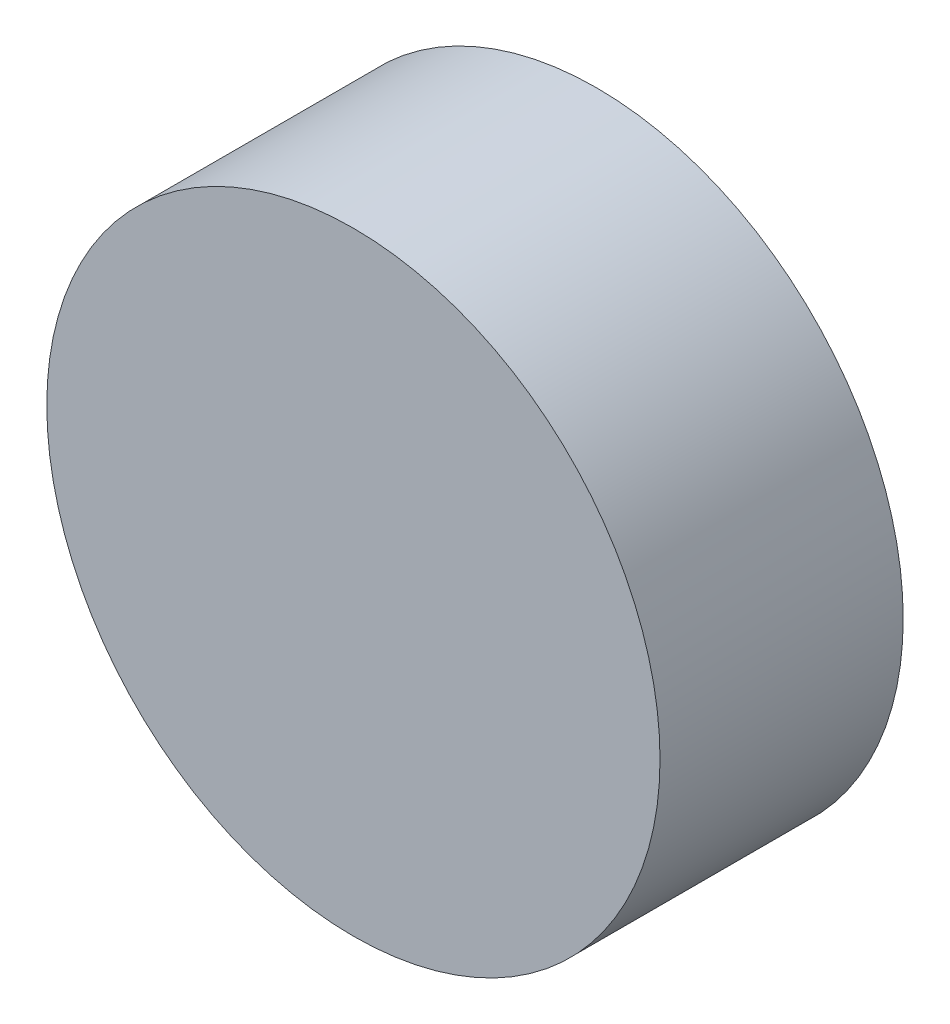
ISO-10303-21;
HEADER;
FILE_DESCRIPTION(('STEP AP214'),'2;1');
FILE_NAME('part.step','',(''),(''),'','','');
FILE_SCHEMA(('AUTOMOTIVE_DESIGN { 1 0 10303 214 1 1 1 1 }'));
ENDSEC;
DATA;
#1=APPLICATION_CONTEXT('core data for automotive mechanical design processes');
#2=APPLICATION_PROTOCOL_DEFINITION('international standard','automotive_design',2000,#1);
#3=PRODUCT_CONTEXT('',#1,'mechanical');
#4=PRODUCT('Part','Part','',(#3));
#5=PRODUCT_RELATED_PRODUCT_CATEGORY('part','',(#4));
#6=PRODUCT_DEFINITION_FORMATION('','',#4);
#7=PRODUCT_DEFINITION_CONTEXT('part definition',#1,'design');
#8=PRODUCT_DEFINITION('design','',#6,#7);
#9=PRODUCT_DEFINITION_SHAPE('','',#8);
#10=(LENGTH_UNIT() NAMED_UNIT(*) SI_UNIT(.MILLI.,.METRE.));
#11=(NAMED_UNIT(*) PLANE_ANGLE_UNIT() SI_UNIT($,.RADIAN.));
#12=(NAMED_UNIT(*) SI_UNIT($,.STERADIAN.) SOLID_ANGLE_UNIT());
#13=UNCERTAINTY_MEASURE_WITH_UNIT(LENGTH_MEASURE(1.E-05),#10,'distance_accuracy_value','');
#14=(GEOMETRIC_REPRESENTATION_CONTEXT(3) GLOBAL_UNCERTAINTY_ASSIGNED_CONTEXT((#13)) GLOBAL_UNIT_ASSIGNED_CONTEXT((#10,
#11,#12)) REPRESENTATION_CONTEXT('',''));
#15=CARTESIAN_POINT('',(0.,0.,0.));
#16=DIRECTION('',(0.,0.,1.));
#17=DIRECTION('',(1.,0.,0.));
#18=AXIS2_PLACEMENT_3D('',#15,#16,#17);
#19=CARTESIAN_POINT('',(0.,0.,4.5999908));
#20=DIRECTION('',(0.,0.,-1.));
#21=DIRECTION('',(-1.,0.,0.));
#22=AXIS2_PLACEMENT_3D('',#19,#20,#21);
#23=CYLINDRICAL_SURFACE('',#22,5.8);
#24=CARTESIAN_POINT('',(0.,0.,4.5999908));
#25=DIRECTION('',(0.,0.,1.));
#26=DIRECTION('',(1.,0.,0.));
#27=AXIS2_PLACEMENT_3D('',#24,#25,#26);
#28=CIRCLE('',#27,5.8);
#29=CARTESIAN_POINT('',(5.8,0.,4.5999908));
#30=VERTEX_POINT('',#29);
#31=EDGE_CURVE('E10',#30,#30,#28,.T.);
#32=ORIENTED_EDGE('',*,*,#31,.F.);
#33=EDGE_LOOP('',(#32));
#34=FACE_BOUND('',#33,.T.);
#35=CARTESIAN_POINT('',(0.,0.,0.));
#36=DIRECTION('',(0.,0.,1.));
#37=DIRECTION('',(1.,0.,0.));
#38=AXIS2_PLACEMENT_3D('',#35,#36,#37);
#39=CIRCLE('',#38,5.8);
#40=CARTESIAN_POINT('',(5.8,0.,0.));
#41=VERTEX_POINT('',#40);
#42=EDGE_CURVE('E33',#41,#41,#39,.T.);
#43=ORIENTED_EDGE('',*,*,#42,.T.);
#44=EDGE_LOOP('',(#43));
#45=FACE_BOUND('',#44,.T.);
#46=ADVANCED_FACE('F30',(#34,#45),#23,.T.);
#47=CARTESIAN_POINT('',(0.,0.,4.5999908));
#48=DIRECTION('',(0.,0.,1.));
#49=DIRECTION('',(1.,0.,0.));
#50=AXIS2_PLACEMENT_3D('',#47,#48,#49);
#51=PLANE('',#50);
#52=ORIENTED_EDGE('',*,*,#31,.T.);
#53=EDGE_LOOP('',(#52));
#54=FACE_BOUND('',#53,.T.);
#55=ADVANCED_FACE('F45',(#54),#51,.T.);
#56=CARTESIAN_POINT('',(0.,0.,0.));
#57=DIRECTION('',(0.,0.,1.));
#58=DIRECTION('',(1.,0.,0.));
#59=AXIS2_PLACEMENT_3D('',#56,#57,#58);
#60=PLANE('',#59);
#61=ORIENTED_EDGE('',*,*,#42,.F.);
#62=EDGE_LOOP('',(#61));
#63=FACE_BOUND('',#62,.T.);
#64=ADVANCED_FACE('F43',(#63),#60,.F.);
#65=CLOSED_SHELL('',(#46,#55,#64));
#66=MANIFOLD_SOLID_BREP('B2',#65);
#67=ADVANCED_BREP_SHAPE_REPRESENTATION('',(#18,#66),#14);
#68=SHAPE_DEFINITION_REPRESENTATION(#9,#67);
ENDSEC;
END-ISO-10303-21;
